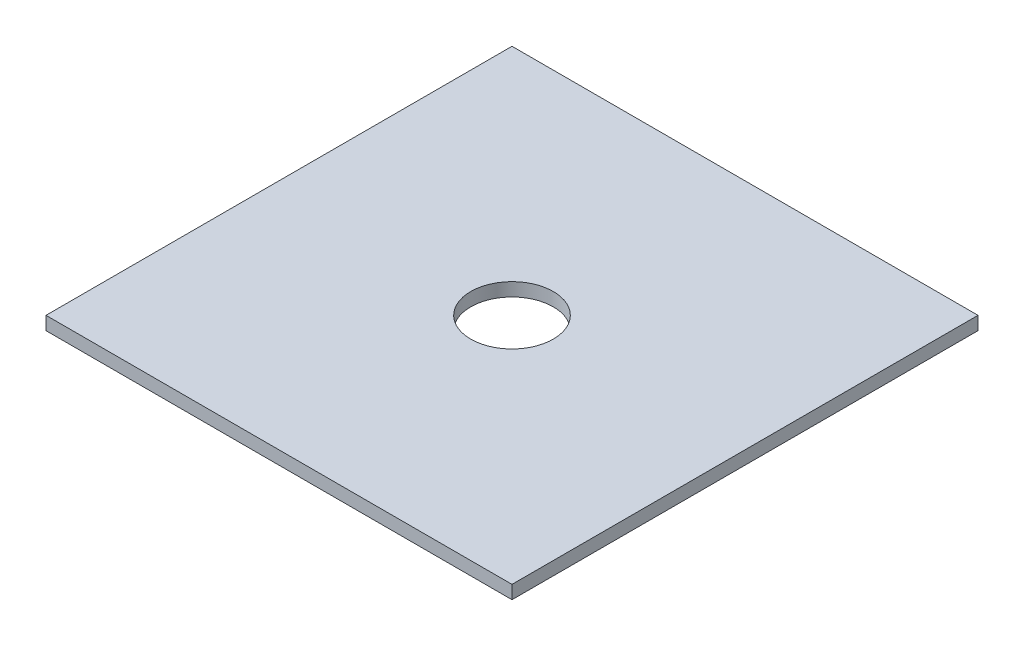
ISO-10303-21;
HEADER;
FILE_DESCRIPTION(('STEP AP214'),'2;1');
FILE_NAME('part.step','',(''),(''),'','','');
FILE_SCHEMA(('AUTOMOTIVE_DESIGN { 1 0 10303 214 1 1 1 1 }'));
ENDSEC;
DATA;
#1=APPLICATION_CONTEXT('core data for automotive mechanical design processes');
#2=APPLICATION_PROTOCOL_DEFINITION('international standard','automotive_design',2000,#1);
#3=PRODUCT_CONTEXT('',#1,'mechanical');
#4=PRODUCT('Part','Part','',(#3));
#5=PRODUCT_RELATED_PRODUCT_CATEGORY('part','',(#4));
#6=PRODUCT_DEFINITION_FORMATION('','',#4);
#7=PRODUCT_DEFINITION_CONTEXT('part definition',#1,'design');
#8=PRODUCT_DEFINITION('design','',#6,#7);
#9=PRODUCT_DEFINITION_SHAPE('','',#8);
#10=(LENGTH_UNIT() NAMED_UNIT(*) SI_UNIT(.MILLI.,.METRE.));
#11=(NAMED_UNIT(*) PLANE_ANGLE_UNIT() SI_UNIT($,.RADIAN.));
#12=(NAMED_UNIT(*) SI_UNIT($,.STERADIAN.) SOLID_ANGLE_UNIT());
#13=UNCERTAINTY_MEASURE_WITH_UNIT(LENGTH_MEASURE(1.E-05),#10,'distance_accuracy_value','');
#14=(GEOMETRIC_REPRESENTATION_CONTEXT(3) GLOBAL_UNCERTAINTY_ASSIGNED_CONTEXT((#13)) GLOBAL_UNIT_ASSIGNED_CONTEXT((#10,
#11,#12)) REPRESENTATION_CONTEXT('',''));
#15=CARTESIAN_POINT('',(0.,0.,0.));
#16=DIRECTION('',(0.,0.,1.));
#17=DIRECTION('',(1.,0.,0.));
#18=AXIS2_PLACEMENT_3D('',#15,#16,#17);
#19=CARTESIAN_POINT('',(17.5,41.,-17.5));
#20=DIRECTION('',(-1.,0.,0.));
#21=DIRECTION('',(0.,0.,1.));
#22=AXIS2_PLACEMENT_3D('',#19,#20,#21);
#23=PLANE('',#22);
#24=DIRECTION('',(0.,0.,-1.));
#25=VECTOR('',#24,1.);
#26=CARTESIAN_POINT('',(17.5,40.,-17.5));
#27=LINE('',#26,#25);
#28=CARTESIAN_POINT('',(17.5,40.,17.5));
#29=VERTEX_POINT('',#28);
#30=CARTESIAN_POINT('',(17.5,40.,-17.5));
#31=VERTEX_POINT('',#30);
#32=EDGE_CURVE('E98',#29,#31,#27,.T.);
#33=ORIENTED_EDGE('',*,*,#32,.T.);
#34=DIRECTION('',(0.,-1.,0.));
#35=VECTOR('',#34,1.);
#36=CARTESIAN_POINT('',(17.5,41.,-17.5));
#37=LINE('',#36,#35);
#38=CARTESIAN_POINT('',(17.5,41.,-17.5));
#39=VERTEX_POINT('',#38);
#40=EDGE_CURVE('E11',#39,#31,#37,.T.);
#41=ORIENTED_EDGE('',*,*,#40,.F.);
#42=DIRECTION('',(0.,0.,-1.));
#43=VECTOR('',#42,1.);
#44=CARTESIAN_POINT('',(17.5,41.,-17.5));
#45=LINE('',#44,#43);
#46=CARTESIAN_POINT('',(17.5,41.,17.5));
#47=VERTEX_POINT('',#46);
#48=EDGE_CURVE('E86',#47,#39,#45,.T.);
#49=ORIENTED_EDGE('',*,*,#48,.F.);
#50=DIRECTION('',(0.,-1.,0.));
#51=VECTOR('',#50,1.);
#52=CARTESIAN_POINT('',(17.5,41.,17.5));
#53=LINE('',#52,#51);
#54=EDGE_CURVE('E94',#47,#29,#53,.T.);
#55=ORIENTED_EDGE('',*,*,#54,.T.);
#56=EDGE_LOOP('',(#33,#41,#49,#55));
#57=FACE_BOUND('',#56,.T.);
#58=ADVANCED_FACE('F35',(#57),#23,.F.);
#59=CARTESIAN_POINT('',(-17.5,41.,-17.5));
#60=DIRECTION('',(0.,0.,1.));
#61=DIRECTION('',(1.,0.,0.));
#62=AXIS2_PLACEMENT_3D('',#59,#60,#61);
#63=PLANE('',#62);
#64=DIRECTION('',(-1.,0.,0.));
#65=VECTOR('',#64,1.);
#66=CARTESIAN_POINT('',(-17.5,40.,-17.5));
#67=LINE('',#66,#65);
#68=CARTESIAN_POINT('',(-17.5,40.,-17.5));
#69=VERTEX_POINT('',#68);
#70=EDGE_CURVE('E90',#31,#69,#67,.T.);
#71=ORIENTED_EDGE('',*,*,#70,.T.);
#72=DIRECTION('',(0.,-1.,0.));
#73=VECTOR('',#72,1.);
#74=CARTESIAN_POINT('',(-17.5,41.,-17.5));
#75=LINE('',#74,#73);
#76=CARTESIAN_POINT('',(-17.5,41.,-17.5));
#77=VERTEX_POINT('',#76);
#78=EDGE_CURVE('E43',#77,#69,#75,.T.);
#79=ORIENTED_EDGE('',*,*,#78,.F.);
#80=DIRECTION('',(-1.,0.,0.));
#81=VECTOR('',#80,1.);
#82=CARTESIAN_POINT('',(-17.5,41.,-17.5));
#83=LINE('',#82,#81);
#84=EDGE_CURVE('E81',#39,#77,#83,.T.);
#85=ORIENTED_EDGE('',*,*,#84,.F.);
#86=ORIENTED_EDGE('',*,*,#40,.T.);
#87=EDGE_LOOP('',(#71,#79,#85,#86));
#88=FACE_BOUND('',#87,.T.);
#89=ADVANCED_FACE('F89',(#88),#63,.F.);
#90=CARTESIAN_POINT('',(-17.5,41.,-17.5));
#91=DIRECTION('',(1.,0.,0.));
#92=DIRECTION('',(0.,0.,-1.));
#93=AXIS2_PLACEMENT_3D('',#90,#91,#92);
#94=PLANE('',#93);
#95=DIRECTION('',(0.,0.,1.));
#96=VECTOR('',#95,1.);
#97=CARTESIAN_POINT('',(-17.5,40.,-17.5));
#98=LINE('',#97,#96);
#99=CARTESIAN_POINT('',(-17.5,40.,17.5));
#100=VERTEX_POINT('',#99);
#101=EDGE_CURVE('E68',#69,#100,#98,.T.);
#102=ORIENTED_EDGE('',*,*,#101,.T.);
#103=DIRECTION('',(0.,-1.,0.));
#104=VECTOR('',#103,1.);
#105=CARTESIAN_POINT('',(-17.5,41.,17.5));
#106=LINE('',#105,#104);
#107=CARTESIAN_POINT('',(-17.5,41.,17.5));
#108=VERTEX_POINT('',#107);
#109=EDGE_CURVE('E91',#108,#100,#106,.T.);
#110=ORIENTED_EDGE('',*,*,#109,.F.);
#111=DIRECTION('',(0.,0.,1.));
#112=VECTOR('',#111,1.);
#113=CARTESIAN_POINT('',(-17.5,41.,-17.5));
#114=LINE('',#113,#112);
#115=EDGE_CURVE('E84',#77,#108,#114,.T.);
#116=ORIENTED_EDGE('',*,*,#115,.F.);
#117=ORIENTED_EDGE('',*,*,#78,.T.);
#118=EDGE_LOOP('',(#102,#110,#116,#117));
#119=FACE_BOUND('',#118,.T.);
#120=ADVANCED_FACE('F92',(#119),#94,.F.);
#121=CARTESIAN_POINT('',(-17.5,41.,17.5));
#122=DIRECTION('',(0.,0.,-1.));
#123=DIRECTION('',(-1.,0.,0.));
#124=AXIS2_PLACEMENT_3D('',#121,#122,#123);
#125=PLANE('',#124);
#126=DIRECTION('',(1.,0.,0.));
#127=VECTOR('',#126,1.);
#128=CARTESIAN_POINT('',(-17.5,40.,17.5));
#129=LINE('',#128,#127);
#130=EDGE_CURVE('E74',#100,#29,#129,.T.);
#131=ORIENTED_EDGE('',*,*,#130,.T.);
#132=ORIENTED_EDGE('',*,*,#54,.F.);
#133=DIRECTION('',(1.,0.,0.));
#134=VECTOR('',#133,1.);
#135=CARTESIAN_POINT('',(-17.5,41.,17.5));
#136=LINE('',#135,#134);
#137=EDGE_CURVE('E51',#108,#47,#136,.T.);
#138=ORIENTED_EDGE('',*,*,#137,.F.);
#139=ORIENTED_EDGE('',*,*,#109,.T.);
#140=EDGE_LOOP('',(#131,#132,#138,#139));
#141=FACE_BOUND('',#140,.T.);
#142=ADVANCED_FACE('F106',(#141),#125,.F.);
#143=CARTESIAN_POINT('',(0.,41.,0.));
#144=DIRECTION('',(0.,1.,0.));
#145=DIRECTION('',(0.,0.,1.));
#146=AXIS2_PLACEMENT_3D('',#143,#144,#145);
#147=PLANE('',#146);
#148=CARTESIAN_POINT('',(0.,41.,0.));
#149=DIRECTION('',(0.,1.,0.));
#150=DIRECTION('',(0.,0.,1.));
#151=AXIS2_PLACEMENT_3D('',#148,#149,#150);
#152=CIRCLE('',#151,3.1);
#153=CARTESIAN_POINT('',(0.,41.,3.1));
#154=VERTEX_POINT('',#153);
#155=EDGE_CURVE('E112',#154,#154,#152,.T.);
#156=ORIENTED_EDGE('',*,*,#155,.F.);
#157=EDGE_LOOP('',(#156));
#158=FACE_BOUND('',#157,.T.);
#159=ORIENTED_EDGE('',*,*,#48,.T.);
#160=ORIENTED_EDGE('',*,*,#84,.T.);
#161=ORIENTED_EDGE('',*,*,#115,.T.);
#162=ORIENTED_EDGE('',*,*,#137,.T.);
#163=EDGE_LOOP('',(#159,#160,#161,#162));
#164=FACE_BOUND('',#163,.T.);
#165=ADVANCED_FACE('F82',(#158,#164),#147,.T.);
#166=CARTESIAN_POINT('',(0.,40.,0.));
#167=DIRECTION('',(0.,1.,0.));
#168=DIRECTION('',(0.,0.,1.));
#169=AXIS2_PLACEMENT_3D('',#166,#167,#168);
#170=PLANE('',#169);
#171=CARTESIAN_POINT('',(0.,40.,0.));
#172=DIRECTION('',(0.,1.,0.));
#173=DIRECTION('',(0.,0.,1.));
#174=AXIS2_PLACEMENT_3D('',#171,#172,#173);
#175=CIRCLE('',#174,3.1);
#176=CARTESIAN_POINT('',(0.,40.,3.1));
#177=VERTEX_POINT('',#176);
#178=EDGE_CURVE('E101',#177,#177,#175,.T.);
#179=ORIENTED_EDGE('',*,*,#178,.T.);
#180=EDGE_LOOP('',(#179));
#181=FACE_BOUND('',#180,.T.);
#182=ORIENTED_EDGE('',*,*,#32,.F.);
#183=ORIENTED_EDGE('',*,*,#130,.F.);
#184=ORIENTED_EDGE('',*,*,#101,.F.);
#185=ORIENTED_EDGE('',*,*,#70,.F.);
#186=EDGE_LOOP('',(#182,#183,#184,#185));
#187=FACE_BOUND('',#186,.T.);
#188=ADVANCED_FACE('F109',(#181,#187),#170,.F.);
#189=CARTESIAN_POINT('',(0.,40.,0.));
#190=DIRECTION('',(0.,1.,0.));
#191=DIRECTION('',(0.,0.,1.));
#192=AXIS2_PLACEMENT_3D('',#189,#190,#191);
#193=CYLINDRICAL_SURFACE('',#192,3.1);
#194=ORIENTED_EDGE('',*,*,#178,.F.);
#195=EDGE_LOOP('',(#194));
#196=FACE_BOUND('',#195,.T.);
#197=ORIENTED_EDGE('',*,*,#155,.T.);
#198=EDGE_LOOP('',(#197));
#199=FACE_BOUND('',#198,.T.);
#200=ADVANCED_FACE('F119',(#196,#199),#193,.F.);
#201=CLOSED_SHELL('',(#58,#89,#120,#142,#165,#188,#200));
#202=MANIFOLD_SOLID_BREP('B2',#201);
#203=ADVANCED_BREP_SHAPE_REPRESENTATION('',(#18,#202),#14);
#204=SHAPE_DEFINITION_REPRESENTATION(#9,#203);
ENDSEC;
END-ISO-10303-21;
